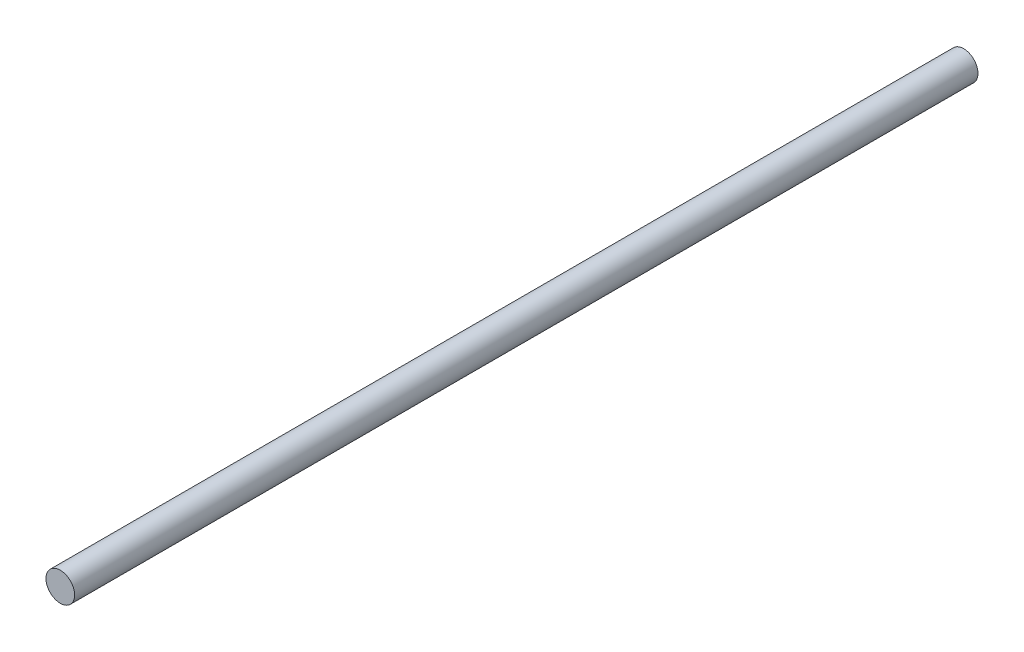
ISO-10303-21;
HEADER;
FILE_DESCRIPTION(('STEP AP214'),'2;1');
FILE_NAME('part.step','',(''),(''),'','','');
FILE_SCHEMA(('AUTOMOTIVE_DESIGN { 1 0 10303 214 1 1 1 1 }'));
ENDSEC;
DATA;
#1=APPLICATION_CONTEXT('core data for automotive mechanical design processes');
#2=APPLICATION_PROTOCOL_DEFINITION('international standard','automotive_design',2000,#1);
#3=PRODUCT_CONTEXT('',#1,'mechanical');
#4=PRODUCT('Part','Part','',(#3));
#5=PRODUCT_RELATED_PRODUCT_CATEGORY('part','',(#4));
#6=PRODUCT_DEFINITION_FORMATION('','',#4);
#7=PRODUCT_DEFINITION_CONTEXT('part definition',#1,'design');
#8=PRODUCT_DEFINITION('design','',#6,#7);
#9=PRODUCT_DEFINITION_SHAPE('','',#8);
#10=(LENGTH_UNIT() NAMED_UNIT(*) SI_UNIT(.MILLI.,.METRE.));
#11=(NAMED_UNIT(*) PLANE_ANGLE_UNIT() SI_UNIT($,.RADIAN.));
#12=(NAMED_UNIT(*) SI_UNIT($,.STERADIAN.) SOLID_ANGLE_UNIT());
#13=UNCERTAINTY_MEASURE_WITH_UNIT(LENGTH_MEASURE(1.E-05),#10,'distance_accuracy_value','');
#14=(GEOMETRIC_REPRESENTATION_CONTEXT(3) GLOBAL_UNCERTAINTY_ASSIGNED_CONTEXT((#13)) GLOBAL_UNIT_ASSIGNED_CONTEXT((#10,
#11,#12)) REPRESENTATION_CONTEXT('',''));
#15=CARTESIAN_POINT('',(0.,0.,0.));
#16=DIRECTION('',(0.,0.,1.));
#17=DIRECTION('',(1.,0.,0.));
#18=AXIS2_PLACEMENT_3D('',#15,#16,#17);
#19=CARTESIAN_POINT('',(0.,0.,94.55));
#20=DIRECTION('',(0.,0.,-1.));
#21=DIRECTION('',(-1.,0.,0.));
#22=AXIS2_PLACEMENT_3D('',#19,#20,#21);
#23=CYLINDRICAL_SURFACE('',#22,1.5);
#24=CARTESIAN_POINT('',(0.,0.,94.55));
#25=DIRECTION('',(0.,0.,1.));
#26=DIRECTION('',(1.,0.,0.));
#27=AXIS2_PLACEMENT_3D('',#24,#25,#26);
#28=CIRCLE('',#27,1.5);
#29=CARTESIAN_POINT('',(1.5,0.,94.55));
#30=VERTEX_POINT('',#29);
#31=EDGE_CURVE('E10',#30,#30,#28,.T.);
#32=ORIENTED_EDGE('',*,*,#31,.F.);
#33=EDGE_LOOP('',(#32));
#34=FACE_BOUND('',#33,.T.);
#35=CARTESIAN_POINT('',(0.,0.,0.));
#36=DIRECTION('',(0.,0.,1.));
#37=DIRECTION('',(1.,0.,0.));
#38=AXIS2_PLACEMENT_3D('',#35,#36,#37);
#39=CIRCLE('',#38,1.5);
#40=CARTESIAN_POINT('',(1.5,0.,0.));
#41=VERTEX_POINT('',#40);
#42=EDGE_CURVE('E38',#41,#41,#39,.T.);
#43=ORIENTED_EDGE('',*,*,#42,.T.);
#44=EDGE_LOOP('',(#43));
#45=FACE_BOUND('',#44,.T.);
#46=ADVANCED_FACE('F35',(#34,#45),#23,.T.);
#47=CARTESIAN_POINT('',(0.,0.,94.55));
#48=DIRECTION('',(0.,0.,1.));
#49=DIRECTION('',(1.,0.,0.));
#50=AXIS2_PLACEMENT_3D('',#47,#48,#49);
#51=PLANE('',#50);
#52=ORIENTED_EDGE('',*,*,#31,.T.);
#53=EDGE_LOOP('',(#52));
#54=FACE_BOUND('',#53,.T.);
#55=ADVANCED_FACE('F50',(#54),#51,.T.);
#56=CARTESIAN_POINT('',(0.,0.,0.));
#57=DIRECTION('',(0.,0.,1.));
#58=DIRECTION('',(1.,0.,0.));
#59=AXIS2_PLACEMENT_3D('',#56,#57,#58);
#60=PLANE('',#59);
#61=ORIENTED_EDGE('',*,*,#42,.F.);
#62=EDGE_LOOP('',(#61));
#63=FACE_BOUND('',#62,.T.);
#64=ADVANCED_FACE('F48',(#63),#60,.F.);
#65=CLOSED_SHELL('',(#46,#55,#64));
#66=MANIFOLD_SOLID_BREP('B2',#65);
#67=ADVANCED_BREP_SHAPE_REPRESENTATION('',(#18,#66),#14);
#68=SHAPE_DEFINITION_REPRESENTATION(#9,#67);
ENDSEC;
END-ISO-10303-21;
